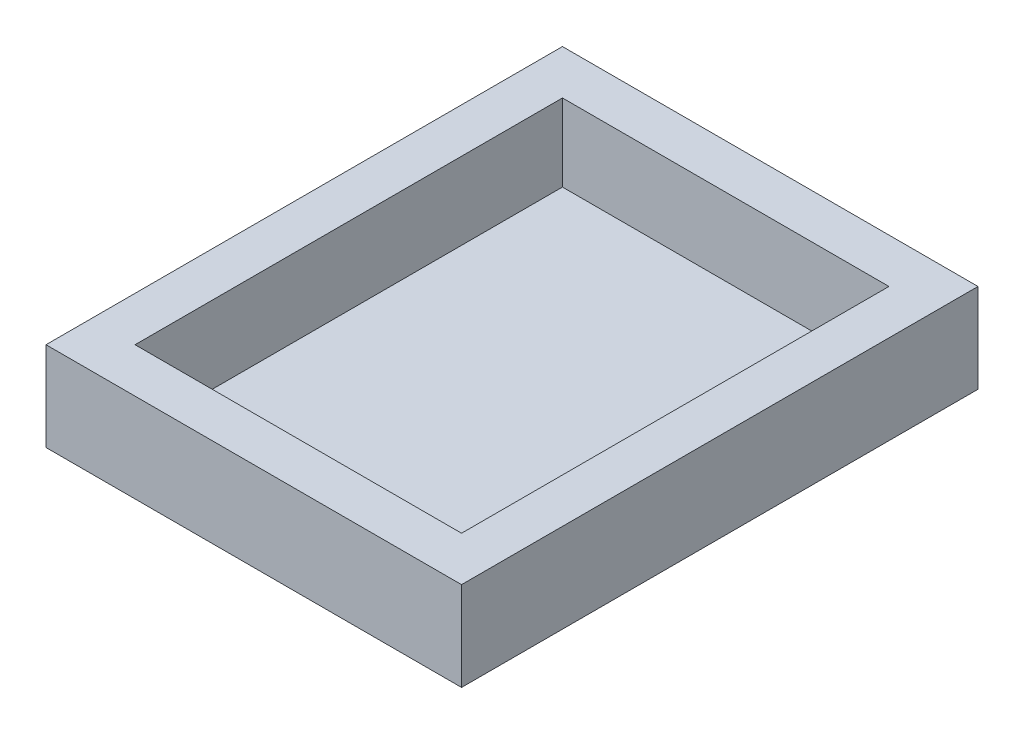
ISO-10303-21;
HEADER;
FILE_DESCRIPTION(('STEP AP214'),'2;1');
FILE_NAME('part.step','',(''),(''),'','','');
FILE_SCHEMA(('AUTOMOTIVE_DESIGN { 1 0 10303 214 1 1 1 1 }'));
ENDSEC;
DATA;
#1=APPLICATION_CONTEXT('core data for automotive mechanical design processes');
#2=APPLICATION_PROTOCOL_DEFINITION('international standard','automotive_design',2000,#1);
#3=PRODUCT_CONTEXT('',#1,'mechanical');
#4=PRODUCT('Part','Part','',(#3));
#5=PRODUCT_RELATED_PRODUCT_CATEGORY('part','',(#4));
#6=PRODUCT_DEFINITION_FORMATION('','',#4);
#7=PRODUCT_DEFINITION_CONTEXT('part definition',#1,'design');
#8=PRODUCT_DEFINITION('design','',#6,#7);
#9=PRODUCT_DEFINITION_SHAPE('','',#8);
#10=(LENGTH_UNIT() NAMED_UNIT(*) SI_UNIT(.MILLI.,.METRE.));
#11=(NAMED_UNIT(*) PLANE_ANGLE_UNIT() SI_UNIT($,.RADIAN.));
#12=(NAMED_UNIT(*) SI_UNIT($,.STERADIAN.) SOLID_ANGLE_UNIT());
#13=UNCERTAINTY_MEASURE_WITH_UNIT(LENGTH_MEASURE(1.E-05),#10,'distance_accuracy_value','');
#14=(GEOMETRIC_REPRESENTATION_CONTEXT(3) GLOBAL_UNCERTAINTY_ASSIGNED_CONTEXT((#13)) GLOBAL_UNIT_ASSIGNED_CONTEXT((#10,
#11,#12)) REPRESENTATION_CONTEXT('',''));
#15=CARTESIAN_POINT('',(0.,0.,0.));
#16=DIRECTION('',(0.,0.,1.));
#17=DIRECTION('',(1.,0.,0.));
#18=AXIS2_PLACEMENT_3D('',#15,#16,#17);
#19=CARTESIAN_POINT('',(-35.,15.,43.5));
#20=DIRECTION('',(1.,0.,0.));
#21=DIRECTION('',(0.,0.,-1.));
#22=AXIS2_PLACEMENT_3D('',#19,#20,#21);
#23=PLANE('',#22);
#24=DIRECTION('',(0.,0.,1.));
#25=VECTOR('',#24,1.);
#26=CARTESIAN_POINT('',(-35.,0.,43.5));
#27=LINE('',#26,#25);
#28=CARTESIAN_POINT('',(-35.,0.,-43.5));
#29=VERTEX_POINT('',#28);
#30=CARTESIAN_POINT('',(-35.,0.,43.5));
#31=VERTEX_POINT('',#30);
#32=EDGE_CURVE('E143',#29,#31,#27,.T.);
#33=ORIENTED_EDGE('',*,*,#32,.T.);
#34=DIRECTION('',(0.,-1.,0.));
#35=VECTOR('',#34,1.);
#36=CARTESIAN_POINT('',(-35.,15.,43.5));
#37=LINE('',#36,#35);
#38=CARTESIAN_POINT('',(-35.,15.,43.5));
#39=VERTEX_POINT('',#38);
#40=EDGE_CURVE('E11',#39,#31,#37,.T.);
#41=ORIENTED_EDGE('',*,*,#40,.F.);
#42=DIRECTION('',(0.,0.,1.));
#43=VECTOR('',#42,1.);
#44=CARTESIAN_POINT('',(-35.,15.,43.5));
#45=LINE('',#44,#43);
#46=CARTESIAN_POINT('',(-35.,15.,-43.5));
#47=VERTEX_POINT('',#46);
#48=EDGE_CURVE('E147',#47,#39,#45,.T.);
#49=ORIENTED_EDGE('',*,*,#48,.F.);
#50=DIRECTION('',(0.,-1.,0.));
#51=VECTOR('',#50,1.);
#52=CARTESIAN_POINT('',(-35.,15.,-43.5));
#53=LINE('',#52,#51);
#54=EDGE_CURVE('E153',#47,#29,#53,.T.);
#55=ORIENTED_EDGE('',*,*,#54,.T.);
#56=EDGE_LOOP('',(#33,#41,#49,#55));
#57=FACE_BOUND('',#56,.T.);
#58=ADVANCED_FACE('F35',(#57),#23,.F.);
#59=CARTESIAN_POINT('',(35.,15.,43.5));
#60=DIRECTION('',(0.,0.,-1.));
#61=DIRECTION('',(-1.,0.,0.));
#62=AXIS2_PLACEMENT_3D('',#59,#60,#61);
#63=PLANE('',#62);
#64=DIRECTION('',(1.,0.,0.));
#65=VECTOR('',#64,1.);
#66=CARTESIAN_POINT('',(35.,0.,43.5));
#67=LINE('',#66,#65);
#68=CARTESIAN_POINT('',(35.,0.,43.5));
#69=VERTEX_POINT('',#68);
#70=EDGE_CURVE('E156',#31,#69,#67,.T.);
#71=ORIENTED_EDGE('',*,*,#70,.T.);
#72=DIRECTION('',(0.,-1.,0.));
#73=VECTOR('',#72,1.);
#74=CARTESIAN_POINT('',(35.,15.,43.5));
#75=LINE('',#74,#73);
#76=CARTESIAN_POINT('',(35.,15.,43.5));
#77=VERTEX_POINT('',#76);
#78=EDGE_CURVE('E42',#77,#69,#75,.T.);
#79=ORIENTED_EDGE('',*,*,#78,.F.);
#80=DIRECTION('',(1.,0.,0.));
#81=VECTOR('',#80,1.);
#82=CARTESIAN_POINT('',(35.,15.,43.5));
#83=LINE('',#82,#81);
#84=EDGE_CURVE('E86',#39,#77,#83,.T.);
#85=ORIENTED_EDGE('',*,*,#84,.F.);
#86=ORIENTED_EDGE('',*,*,#40,.T.);
#87=EDGE_LOOP('',(#71,#79,#85,#86));
#88=FACE_BOUND('',#87,.T.);
#89=ADVANCED_FACE('F185',(#88),#63,.F.);
#90=CARTESIAN_POINT('',(35.,15.,43.5));
#91=DIRECTION('',(-1.,0.,0.));
#92=DIRECTION('',(0.,0.,1.));
#93=AXIS2_PLACEMENT_3D('',#90,#91,#92);
#94=PLANE('',#93);
#95=DIRECTION('',(0.,0.,-1.));
#96=VECTOR('',#95,1.);
#97=CARTESIAN_POINT('',(35.,0.,43.5));
#98=LINE('',#97,#96);
#99=CARTESIAN_POINT('',(35.,0.,-43.5));
#100=VERTEX_POINT('',#99);
#101=EDGE_CURVE('E158',#69,#100,#98,.T.);
#102=ORIENTED_EDGE('',*,*,#101,.T.);
#103=DIRECTION('',(0.,-1.,0.));
#104=VECTOR('',#103,1.);
#105=CARTESIAN_POINT('',(35.,15.,-43.5));
#106=LINE('',#105,#104);
#107=CARTESIAN_POINT('',(35.,15.,-43.5));
#108=VERTEX_POINT('',#107);
#109=EDGE_CURVE('E162',#108,#100,#106,.T.);
#110=ORIENTED_EDGE('',*,*,#109,.F.);
#111=DIRECTION('',(0.,0.,-1.));
#112=VECTOR('',#111,1.);
#113=CARTESIAN_POINT('',(35.,15.,43.5));
#114=LINE('',#113,#112);
#115=EDGE_CURVE('E150',#77,#108,#114,.T.);
#116=ORIENTED_EDGE('',*,*,#115,.F.);
#117=ORIENTED_EDGE('',*,*,#78,.T.);
#118=EDGE_LOOP('',(#102,#110,#116,#117));
#119=FACE_BOUND('',#118,.T.);
#120=ADVANCED_FACE('F167',(#119),#94,.F.);
#121=CARTESIAN_POINT('',(35.,15.,-43.5));
#122=DIRECTION('',(0.,0.,1.));
#123=DIRECTION('',(1.,0.,0.));
#124=AXIS2_PLACEMENT_3D('',#121,#122,#123);
#125=PLANE('',#124);
#126=DIRECTION('',(-1.,0.,0.));
#127=VECTOR('',#126,1.);
#128=CARTESIAN_POINT('',(35.,0.,-43.5));
#129=LINE('',#128,#127);
#130=EDGE_CURVE('E79',#100,#29,#129,.T.);
#131=ORIENTED_EDGE('',*,*,#130,.T.);
#132=ORIENTED_EDGE('',*,*,#54,.F.);
#133=DIRECTION('',(-1.,0.,0.));
#134=VECTOR('',#133,1.);
#135=CARTESIAN_POINT('',(35.,15.,-43.5));
#136=LINE('',#135,#134);
#137=EDGE_CURVE('E58',#108,#47,#136,.T.);
#138=ORIENTED_EDGE('',*,*,#137,.F.);
#139=ORIENTED_EDGE('',*,*,#109,.T.);
#140=EDGE_LOOP('',(#131,#132,#138,#139));
#141=FACE_BOUND('',#140,.T.);
#142=ADVANCED_FACE('F175',(#141),#125,.F.);
#143=CARTESIAN_POINT('',(0.,15.,0.));
#144=DIRECTION('',(0.,1.,0.));
#145=DIRECTION('',(0.,0.,1.));
#146=AXIS2_PLACEMENT_3D('',#143,#144,#145);
#147=PLANE('',#146);
#148=DIRECTION('',(0.,0.,1.));
#149=VECTOR('',#148,1.);
#150=CARTESIAN_POINT('',(-27.5,15.,36.));
#151=LINE('',#150,#149);
#152=CARTESIAN_POINT('',(-27.5,15.,-36.));
#153=VERTEX_POINT('',#152);
#154=CARTESIAN_POINT('',(-27.5,15.,36.));
#155=VERTEX_POINT('',#154);
#156=EDGE_CURVE('E49',#153,#155,#151,.T.);
#157=ORIENTED_EDGE('',*,*,#156,.F.);
#158=DIRECTION('',(-1.,0.,0.));
#159=VECTOR('',#158,1.);
#160=CARTESIAN_POINT('',(27.5,15.,-36.));
#161=LINE('',#160,#159);
#162=CARTESIAN_POINT('',(27.5,15.,-36.));
#163=VERTEX_POINT('',#162);
#164=EDGE_CURVE('E128',#163,#153,#161,.T.);
#165=ORIENTED_EDGE('',*,*,#164,.F.);
#166=DIRECTION('',(0.,0.,-1.));
#167=VECTOR('',#166,1.);
#168=CARTESIAN_POINT('',(27.5,15.,36.));
#169=LINE('',#168,#167);
#170=CARTESIAN_POINT('',(27.5,15.,36.));
#171=VERTEX_POINT('',#170);
#172=EDGE_CURVE('E131',#171,#163,#169,.T.);
#173=ORIENTED_EDGE('',*,*,#172,.F.);
#174=DIRECTION('',(1.,0.,0.));
#175=VECTOR('',#174,1.);
#176=CARTESIAN_POINT('',(27.5,15.,36.));
#177=LINE('',#176,#175);
#178=EDGE_CURVE('E137',#155,#171,#177,.T.);
#179=ORIENTED_EDGE('',*,*,#178,.F.);
#180=EDGE_LOOP('',(#157,#165,#173,#179));
#181=FACE_BOUND('',#180,.T.);
#182=ORIENTED_EDGE('',*,*,#48,.T.);
#183=ORIENTED_EDGE('',*,*,#84,.T.);
#184=ORIENTED_EDGE('',*,*,#115,.T.);
#185=ORIENTED_EDGE('',*,*,#137,.T.);
#186=EDGE_LOOP('',(#182,#183,#184,#185));
#187=FACE_BOUND('',#186,.T.);
#188=ADVANCED_FACE('F177',(#181,#187),#147,.T.);
#189=CARTESIAN_POINT('',(0.,0.,0.));
#190=DIRECTION('',(0.,1.,0.));
#191=DIRECTION('',(0.,0.,1.));
#192=AXIS2_PLACEMENT_3D('',#189,#190,#191);
#193=PLANE('',#192);
#194=ORIENTED_EDGE('',*,*,#32,.F.);
#195=ORIENTED_EDGE('',*,*,#130,.F.);
#196=ORIENTED_EDGE('',*,*,#101,.F.);
#197=ORIENTED_EDGE('',*,*,#70,.F.);
#198=EDGE_LOOP('',(#194,#195,#196,#197));
#199=FACE_BOUND('',#198,.T.);
#200=ADVANCED_FACE('F171',(#199),#193,.F.);
#201=CARTESIAN_POINT('',(-27.5,2.,36.));
#202=DIRECTION('',(-1.,0.,0.));
#203=DIRECTION('',(0.,0.,1.));
#204=AXIS2_PLACEMENT_3D('',#201,#202,#203);
#205=PLANE('',#204);
#206=ORIENTED_EDGE('',*,*,#156,.T.);
#207=DIRECTION('',(0.,1.,0.));
#208=VECTOR('',#207,1.);
#209=CARTESIAN_POINT('',(-27.5,2.,36.));
#210=LINE('',#209,#208);
#211=CARTESIAN_POINT('',(-27.5,2.,36.));
#212=VERTEX_POINT('',#211);
#213=EDGE_CURVE('E106',#212,#155,#210,.T.);
#214=ORIENTED_EDGE('',*,*,#213,.F.);
#215=DIRECTION('',(0.,0.,1.));
#216=VECTOR('',#215,1.);
#217=CARTESIAN_POINT('',(-27.5,2.,36.));
#218=LINE('',#217,#216);
#219=CARTESIAN_POINT('',(-27.5,2.,-36.));
#220=VERTEX_POINT('',#219);
#221=EDGE_CURVE('E110',#220,#212,#218,.T.);
#222=ORIENTED_EDGE('',*,*,#221,.F.);
#223=DIRECTION('',(0.,1.,0.));
#224=VECTOR('',#223,1.);
#225=CARTESIAN_POINT('',(-27.5,2.,-36.));
#226=LINE('',#225,#224);
#227=EDGE_CURVE('E141',#220,#153,#226,.T.);
#228=ORIENTED_EDGE('',*,*,#227,.T.);
#229=EDGE_LOOP('',(#206,#214,#222,#228));
#230=FACE_BOUND('',#229,.T.);
#231=ADVANCED_FACE('F108',(#230),#205,.F.);
#232=CARTESIAN_POINT('',(27.5,2.,-36.));
#233=DIRECTION('',(0.,0.,-1.));
#234=DIRECTION('',(-1.,0.,0.));
#235=AXIS2_PLACEMENT_3D('',#232,#233,#234);
#236=PLANE('',#235);
#237=ORIENTED_EDGE('',*,*,#164,.T.);
#238=ORIENTED_EDGE('',*,*,#227,.F.);
#239=DIRECTION('',(-1.,0.,0.));
#240=VECTOR('',#239,1.);
#241=CARTESIAN_POINT('',(27.5,2.,-36.));
#242=LINE('',#241,#240);
#243=CARTESIAN_POINT('',(27.5,2.,-36.));
#244=VERTEX_POINT('',#243);
#245=EDGE_CURVE('E116',#244,#220,#242,.T.);
#246=ORIENTED_EDGE('',*,*,#245,.F.);
#247=DIRECTION('',(0.,1.,0.));
#248=VECTOR('',#247,1.);
#249=CARTESIAN_POINT('',(27.5,2.,-36.));
#250=LINE('',#249,#248);
#251=EDGE_CURVE('E144',#244,#163,#250,.T.);
#252=ORIENTED_EDGE('',*,*,#251,.T.);
#253=EDGE_LOOP('',(#237,#238,#246,#252));
#254=FACE_BOUND('',#253,.T.);
#255=ADVANCED_FACE('F224',(#254),#236,.F.);
#256=CARTESIAN_POINT('',(27.5,2.,36.));
#257=DIRECTION('',(1.,0.,0.));
#258=DIRECTION('',(0.,0.,-1.));
#259=AXIS2_PLACEMENT_3D('',#256,#257,#258);
#260=PLANE('',#259);
#261=ORIENTED_EDGE('',*,*,#172,.T.);
#262=ORIENTED_EDGE('',*,*,#251,.F.);
#263=DIRECTION('',(0.,0.,-1.));
#264=VECTOR('',#263,1.);
#265=CARTESIAN_POINT('',(27.5,2.,36.));
#266=LINE('',#265,#264);
#267=CARTESIAN_POINT('',(27.5,2.,36.));
#268=VERTEX_POINT('',#267);
#269=EDGE_CURVE('E124',#268,#244,#266,.T.);
#270=ORIENTED_EDGE('',*,*,#269,.F.);
#271=DIRECTION('',(0.,1.,0.));
#272=VECTOR('',#271,1.);
#273=CARTESIAN_POINT('',(27.5,2.,36.));
#274=LINE('',#273,#272);
#275=EDGE_CURVE('E115',#268,#171,#274,.T.);
#276=ORIENTED_EDGE('',*,*,#275,.T.);
#277=EDGE_LOOP('',(#261,#262,#270,#276));
#278=FACE_BOUND('',#277,.T.);
#279=ADVANCED_FACE('F233',(#278),#260,.F.);
#280=CARTESIAN_POINT('',(27.5,2.,36.));
#281=DIRECTION('',(0.,0.,1.));
#282=DIRECTION('',(1.,0.,0.));
#283=AXIS2_PLACEMENT_3D('',#280,#281,#282);
#284=PLANE('',#283);
#285=ORIENTED_EDGE('',*,*,#178,.T.);
#286=ORIENTED_EDGE('',*,*,#275,.F.);
#287=DIRECTION('',(1.,0.,0.));
#288=VECTOR('',#287,1.);
#289=CARTESIAN_POINT('',(27.5,2.,36.));
#290=LINE('',#289,#288);
#291=EDGE_CURVE('E119',#212,#268,#290,.T.);
#292=ORIENTED_EDGE('',*,*,#291,.F.);
#293=ORIENTED_EDGE('',*,*,#213,.T.);
#294=EDGE_LOOP('',(#285,#286,#292,#293));
#295=FACE_BOUND('',#294,.T.);
#296=ADVANCED_FACE('F120',(#295),#284,.F.);
#297=CARTESIAN_POINT('',(0.,2.,0.));
#298=DIRECTION('',(0.,1.,0.));
#299=DIRECTION('',(0.,0.,1.));
#300=AXIS2_PLACEMENT_3D('',#297,#298,#299);
#301=PLANE('',#300);
#302=ORIENTED_EDGE('',*,*,#221,.T.);
#303=ORIENTED_EDGE('',*,*,#291,.T.);
#304=ORIENTED_EDGE('',*,*,#269,.T.);
#305=ORIENTED_EDGE('',*,*,#245,.T.);
#306=EDGE_LOOP('',(#302,#303,#304,#305));
#307=FACE_BOUND('',#306,.T.);
#308=ADVANCED_FACE('F126',(#307),#301,.T.);
#309=CLOSED_SHELL('',(#58,#89,#120,#142,#188,#200,#231,#255,#279,#296,#308));
#310=MANIFOLD_SOLID_BREP('B2',#309);
#311=ADVANCED_BREP_SHAPE_REPRESENTATION('',(#18,#310),#14);
#312=SHAPE_DEFINITION_REPRESENTATION(#9,#311);
ENDSEC;
END-ISO-10303-21;
